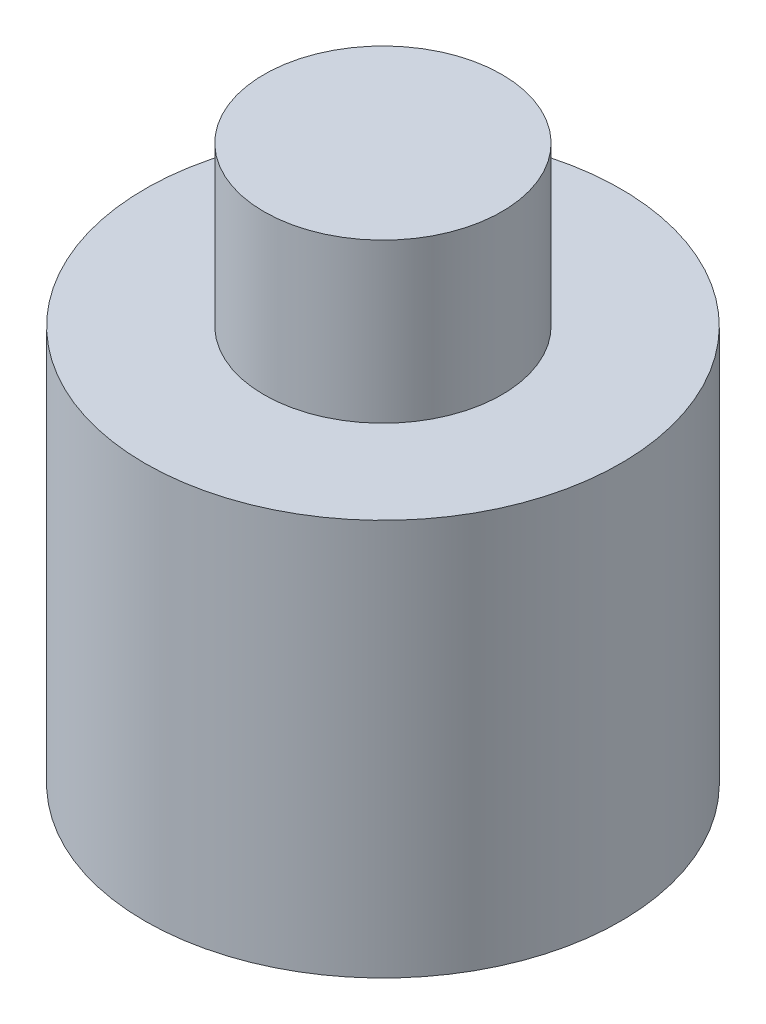
ISO-10303-21;
HEADER;
FILE_DESCRIPTION(('STEP AP214'),'2;1');
FILE_NAME('part.step','',(''),(''),'','','');
FILE_SCHEMA(('AUTOMOTIVE_DESIGN { 1 0 10303 214 1 1 1 1 }'));
ENDSEC;
DATA;
#1=APPLICATION_CONTEXT('core data for automotive mechanical design processes');
#2=APPLICATION_PROTOCOL_DEFINITION('international standard','automotive_design',2000,#1);
#3=PRODUCT_CONTEXT('',#1,'mechanical');
#4=PRODUCT('Part','Part','',(#3));
#5=PRODUCT_RELATED_PRODUCT_CATEGORY('part','',(#4));
#6=PRODUCT_DEFINITION_FORMATION('','',#4);
#7=PRODUCT_DEFINITION_CONTEXT('part definition',#1,'design');
#8=PRODUCT_DEFINITION('design','',#6,#7);
#9=PRODUCT_DEFINITION_SHAPE('','',#8);
#10=(LENGTH_UNIT() NAMED_UNIT(*) SI_UNIT(.MILLI.,.METRE.));
#11=(NAMED_UNIT(*) PLANE_ANGLE_UNIT() SI_UNIT($,.RADIAN.));
#12=(NAMED_UNIT(*) SI_UNIT($,.STERADIAN.) SOLID_ANGLE_UNIT());
#13=UNCERTAINTY_MEASURE_WITH_UNIT(LENGTH_MEASURE(1.E-05),#10,'distance_accuracy_value','');
#14=(GEOMETRIC_REPRESENTATION_CONTEXT(3) GLOBAL_UNCERTAINTY_ASSIGNED_CONTEXT((#13)) GLOBAL_UNIT_ASSIGNED_CONTEXT((#10,
#11,#12)) REPRESENTATION_CONTEXT('',''));
#15=CARTESIAN_POINT('',(0.,0.,0.));
#16=DIRECTION('',(0.,0.,1.));
#17=DIRECTION('',(1.,0.,0.));
#18=AXIS2_PLACEMENT_3D('',#15,#16,#17);
#19=CARTESIAN_POINT('',(0.,50.,0.));
#20=DIRECTION('',(0.,-1.,0.));
#21=DIRECTION('',(0.,0.,-1.));
#22=AXIS2_PLACEMENT_3D('',#19,#20,#21);
#23=CYLINDRICAL_SURFACE('',#22,30.);
#24=CARTESIAN_POINT('',(0.,50.,0.));
#25=DIRECTION('',(0.,1.,0.));
#26=DIRECTION('',(0.,0.,1.));
#27=AXIS2_PLACEMENT_3D('',#24,#25,#26);
#28=CIRCLE('',#27,30.);
#29=CARTESIAN_POINT('',(0.,50.,30.));
#30=VERTEX_POINT('',#29);
#31=EDGE_CURVE('E38',#30,#30,#28,.T.);
#32=ORIENTED_EDGE('',*,*,#31,.F.);
#33=EDGE_LOOP('',(#32));
#34=FACE_BOUND('',#33,.T.);
#35=CARTESIAN_POINT('',(0.,0.,0.));
#36=DIRECTION('',(0.,1.,0.));
#37=DIRECTION('',(0.,0.,1.));
#38=AXIS2_PLACEMENT_3D('',#35,#36,#37);
#39=CIRCLE('',#38,30.);
#40=CARTESIAN_POINT('',(0.,0.,30.));
#41=VERTEX_POINT('',#40);
#42=EDGE_CURVE('E34',#41,#41,#39,.T.);
#43=ORIENTED_EDGE('',*,*,#42,.T.);
#44=EDGE_LOOP('',(#43));
#45=FACE_BOUND('',#44,.T.);
#46=ADVANCED_FACE('F31',(#34,#45),#23,.T.);
#47=CARTESIAN_POINT('',(0.,50.,0.));
#48=DIRECTION('',(0.,1.,0.));
#49=DIRECTION('',(0.,0.,1.));
#50=AXIS2_PLACEMENT_3D('',#47,#48,#49);
#51=PLANE('',#50);
#52=CARTESIAN_POINT('',(0.,50.,0.));
#53=DIRECTION('',(0.,1.,0.));
#54=DIRECTION('',(0.,0.,1.));
#55=AXIS2_PLACEMENT_3D('',#52,#53,#54);
#56=CIRCLE('',#55,15.);
#57=CARTESIAN_POINT('',(0.,50.,15.));
#58=VERTEX_POINT('',#57);
#59=EDGE_CURVE('E10',#58,#58,#56,.T.);
#60=ORIENTED_EDGE('',*,*,#59,.F.);
#61=EDGE_LOOP('',(#60));
#62=FACE_BOUND('',#61,.T.);
#63=ORIENTED_EDGE('',*,*,#31,.T.);
#64=EDGE_LOOP('',(#63));
#65=FACE_BOUND('',#64,.T.);
#66=ADVANCED_FACE('F55',(#62,#65),#51,.T.);
#67=CARTESIAN_POINT('',(0.,0.,0.));
#68=DIRECTION('',(0.,1.,0.));
#69=DIRECTION('',(0.,0.,1.));
#70=AXIS2_PLACEMENT_3D('',#67,#68,#69);
#71=PLANE('',#70);
#72=ORIENTED_EDGE('',*,*,#42,.F.);
#73=EDGE_LOOP('',(#72));
#74=FACE_BOUND('',#73,.T.);
#75=ADVANCED_FACE('F52',(#74),#71,.F.);
#76=CARTESIAN_POINT('',(0.,70.,0.));
#77=DIRECTION('',(0.,-1.,0.));
#78=DIRECTION('',(0.,0.,-1.));
#79=AXIS2_PLACEMENT_3D('',#76,#77,#78);
#80=CYLINDRICAL_SURFACE('',#79,15.);
#81=CARTESIAN_POINT('',(0.,70.,0.));
#82=DIRECTION('',(0.,1.,0.));
#83=DIRECTION('',(0.,0.,1.));
#84=AXIS2_PLACEMENT_3D('',#81,#82,#83);
#85=CIRCLE('',#84,15.);
#86=CARTESIAN_POINT('',(0.,70.,15.));
#87=VERTEX_POINT('',#86);
#88=EDGE_CURVE('E44',#87,#87,#85,.T.);
#89=ORIENTED_EDGE('',*,*,#88,.F.);
#90=EDGE_LOOP('',(#89));
#91=FACE_BOUND('',#90,.T.);
#92=ORIENTED_EDGE('',*,*,#59,.T.);
#93=EDGE_LOOP('',(#92));
#94=FACE_BOUND('',#93,.T.);
#95=ADVANCED_FACE('F54',(#91,#94),#80,.T.);
#96=CARTESIAN_POINT('',(0.,70.,0.));
#97=DIRECTION('',(0.,1.,0.));
#98=DIRECTION('',(0.,0.,1.));
#99=AXIS2_PLACEMENT_3D('',#96,#97,#98);
#100=PLANE('',#99);
#101=ORIENTED_EDGE('',*,*,#88,.T.);
#102=EDGE_LOOP('',(#101));
#103=FACE_BOUND('',#102,.T.);
#104=ADVANCED_FACE('F60',(#103),#100,.T.);
#105=CLOSED_SHELL('',(#46,#66,#75,#95,#104));
#106=MANIFOLD_SOLID_BREP('B2',#105);
#107=ADVANCED_BREP_SHAPE_REPRESENTATION('',(#18,#106),#14);
#108=SHAPE_DEFINITION_REPRESENTATION(#9,#107);
ENDSEC;
END-ISO-10303-21;
